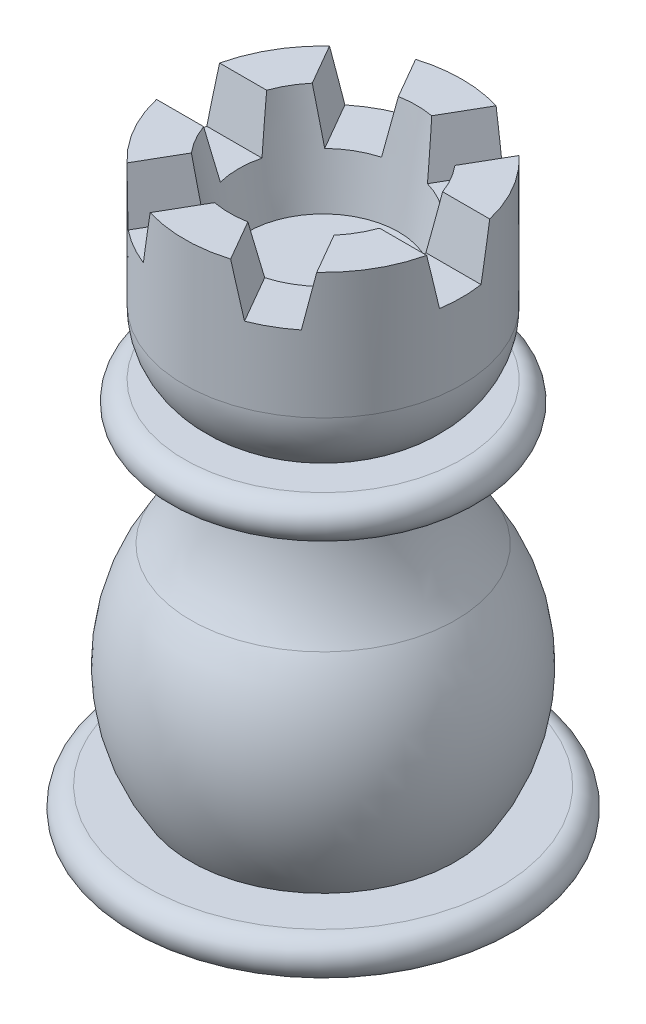
ISO-10303-21;
HEADER;
FILE_DESCRIPTION(('STEP AP214'),'2;1');
FILE_NAME('part.step','',(''),(''),'','','');
FILE_SCHEMA(('AUTOMOTIVE_DESIGN { 1 0 10303 214 1 1 1 1 }'));
ENDSEC;
DATA;
#1=APPLICATION_CONTEXT('core data for automotive mechanical design processes');
#2=APPLICATION_PROTOCOL_DEFINITION('international standard','automotive_design',2000,#1);
#3=PRODUCT_CONTEXT('',#1,'mechanical');
#4=PRODUCT('Part','Part','',(#3));
#5=PRODUCT_RELATED_PRODUCT_CATEGORY('part','',(#4));
#6=PRODUCT_DEFINITION_FORMATION('','',#4);
#7=PRODUCT_DEFINITION_CONTEXT('part definition',#1,'design');
#8=PRODUCT_DEFINITION('design','',#6,#7);
#9=PRODUCT_DEFINITION_SHAPE('','',#8);
#10=(LENGTH_UNIT() NAMED_UNIT(*) SI_UNIT(.MILLI.,.METRE.));
#11=(NAMED_UNIT(*) PLANE_ANGLE_UNIT() SI_UNIT($,.RADIAN.));
#12=(NAMED_UNIT(*) SI_UNIT($,.STERADIAN.) SOLID_ANGLE_UNIT());
#13=UNCERTAINTY_MEASURE_WITH_UNIT(LENGTH_MEASURE(1.E-05),#10,'distance_accuracy_value','');
#14=(GEOMETRIC_REPRESENTATION_CONTEXT(3) GLOBAL_UNCERTAINTY_ASSIGNED_CONTEXT((#13)) GLOBAL_UNIT_ASSIGNED_CONTEXT((#10,
#11,#12)) REPRESENTATION_CONTEXT('',''));
#15=CARTESIAN_POINT('',(0.,0.,0.));
#16=DIRECTION('',(0.,0.,1.));
#17=DIRECTION('',(1.,0.,0.));
#18=AXIS2_PLACEMENT_3D('',#15,#16,#17);
#19=CARTESIAN_POINT('',(0.,46.,0.));
#20=DIRECTION('',(0.,-1.,0.));
#21=DIRECTION('',(0.,0.,-1.));
#22=AXIS2_PLACEMENT_3D('',#19,#20,#21);
#23=PLANE('',#22);
#24=CARTESIAN_POINT('',(0.,46.,0.));
#25=DIRECTION('',(0.,-1.,0.));
#26=DIRECTION('',(0.,0.,-1.));
#27=AXIS2_PLACEMENT_3D('',#24,#25,#26);
#28=CIRCLE('',#27,11.);
#29=CARTESIAN_POINT('',(7.52113483086827,46.,-8.0269876576397));
#30=VERTEX_POINT('',#29);
#31=CARTESIAN_POINT('',(10.7121426428143,46.,-2.5));
#32=VERTEX_POINT('',#31);
#33=EDGE_CURVE('E287',#30,#32,#28,.T.);
#34=ORIENTED_EDGE('',*,*,#33,.F.);
#35=DIRECTION('',(-0.500000000000004,0.,0.866025403784436));
#36=VECTOR('',#35,1.);
#37=CARTESIAN_POINT('',(12.7517603887906,46.,-17.0866968793294));
#38=LINE('',#37,#36);
#39=CARTESIAN_POINT('',(5.65315852006724,46.,-4.79155777999727));
#40=VERTEX_POINT('',#39);
#41=EDGE_CURVE('E382',#30,#40,#38,.T.);
#42=ORIENTED_EDGE('',*,*,#41,.T.);
#43=CARTESIAN_POINT('',(0.,46.,0.));
#44=DIRECTION('',(0.,-1.,0.));
#45=DIRECTION('',(0.,0.,-1.));
#46=AXIS2_PLACEMENT_3D('',#43,#44,#45);
#47=CIRCLE('',#46,7.4106158456677);
#48=CARTESIAN_POINT('',(6.97619002121224,46.,-2.5));
#49=VERTEX_POINT('',#48);
#50=EDGE_CURVE('E299',#40,#49,#47,.T.);
#51=ORIENTED_EDGE('',*,*,#50,.T.);
#52=DIRECTION('',(1.,0.,0.));
#53=VECTOR('',#52,1.);
#54=CARTESIAN_POINT('',(-15.5,46.,-2.5));
#55=LINE('',#54,#53);
#56=EDGE_CURVE('E245',#49,#32,#55,.T.);
#57=ORIENTED_EDGE('',*,*,#56,.T.);
#58=EDGE_LOOP('',(#34,#42,#51,#57));
#59=FACE_BOUND('',#58,.T.);
#60=ADVANCED_FACE('F36',(#59),#23,.F.);
#61=CARTESIAN_POINT('',(-1.32303150114492,46.,-7.29155777999725));
#62=VERTEX_POINT('',#61);
#63=CARTESIAN_POINT('',(1.32303150114505,46.,-7.29155777999729));
#64=VERTEX_POINT('',#63);
#65=EDGE_CURVE('E298',#62,#64,#47,.T.);
#66=ORIENTED_EDGE('',*,*,#65,.T.);
#67=DIRECTION('',(-0.500000000000004,0.,0.866025403784436));
#68=VECTOR('',#67,1.);
#69=CARTESIAN_POINT('',(8.4216333698684,46.,-19.5866968793294));
#70=LINE('',#69,#68);
#71=CARTESIAN_POINT('',(3.19100781194609,46.,-10.5269876576397));
#72=VERTEX_POINT('',#71);
#73=EDGE_CURVE('E379',#72,#64,#70,.T.);
#74=ORIENTED_EDGE('',*,*,#73,.F.);
#75=CARTESIAN_POINT('',(-3.19100781194594,46.,-10.5269876576398));
#76=VERTEX_POINT('',#75);
#77=EDGE_CURVE('E292',#76,#72,#28,.T.);
#78=ORIENTED_EDGE('',*,*,#77,.F.);
#79=DIRECTION('',(-0.499999999999992,0.,-0.866025403784443));
#80=VECTOR('',#79,1.);
#81=CARTESIAN_POINT('',(12.7517603887903,46.,17.0866968793295));
#82=LINE('',#81,#80);
#83=EDGE_CURVE('E367',#62,#76,#82,.T.);
#84=ORIENTED_EDGE('',*,*,#83,.F.);
#85=EDGE_LOOP('',(#66,#74,#78,#84));
#86=FACE_BOUND('',#85,.T.);
#87=ADVANCED_FACE('F396',(#86),#23,.F.);
#88=CARTESIAN_POINT('',(1.32303150114495,46.,7.29155777999731));
#89=VERTEX_POINT('',#88);
#90=CARTESIAN_POINT('',(-1.32303150114505,46.,7.29155777999729));
#91=VERTEX_POINT('',#90);
#92=EDGE_CURVE('E397',#89,#91,#47,.T.);
#93=ORIENTED_EDGE('',*,*,#92,.T.);
#94=CARTESIAN_POINT('',(-3.19100781194609,46.,10.5269876576397));
#95=VERTEX_POINT('',#94);
#96=EDGE_CURVE('E384',#91,#95,#38,.T.);
#97=ORIENTED_EDGE('',*,*,#96,.T.);
#98=CARTESIAN_POINT('',(3.19100781194594,46.,10.5269876576398));
#99=VERTEX_POINT('',#98);
#100=EDGE_CURVE('E485',#99,#95,#28,.T.);
#101=ORIENTED_EDGE('',*,*,#100,.F.);
#102=DIRECTION('',(-0.499999999999992,0.,-0.866025403784443));
#103=VECTOR('',#102,1.);
#104=CARTESIAN_POINT('',(8.42163336986809,46.,19.5866968793294));
#105=LINE('',#104,#103);
#106=EDGE_CURVE('E371',#99,#89,#105,.T.);
#107=ORIENTED_EDGE('',*,*,#106,.T.);
#108=EDGE_LOOP('',(#93,#97,#101,#107));
#109=FACE_BOUND('',#108,.T.);
#110=ADVANCED_FACE('F455',(#109),#23,.F.);
#111=CARTESIAN_POINT('',(-7.52113483086827,46.,8.0269876576397));
#112=VERTEX_POINT('',#111);
#113=CARTESIAN_POINT('',(-10.7121426428143,46.,2.5));
#114=VERTEX_POINT('',#113);
#115=EDGE_CURVE('E291',#112,#114,#28,.T.);
#116=ORIENTED_EDGE('',*,*,#115,.F.);
#117=CARTESIAN_POINT('',(-5.65315852006724,46.,4.79155777999727));
#118=VERTEX_POINT('',#117);
#119=EDGE_CURVE('E380',#118,#112,#70,.T.);
#120=ORIENTED_EDGE('',*,*,#119,.F.);
#121=CARTESIAN_POINT('',(-6.97619002121224,46.,2.5));
#122=VERTEX_POINT('',#121);
#123=EDGE_CURVE('E297',#118,#122,#47,.T.);
#124=ORIENTED_EDGE('',*,*,#123,.T.);
#125=DIRECTION('',(1.,0.,0.));
#126=VECTOR('',#125,1.);
#127=CARTESIAN_POINT('',(-15.5,46.,2.5));
#128=LINE('',#127,#126);
#129=EDGE_CURVE('E254',#114,#122,#128,.T.);
#130=ORIENTED_EDGE('',*,*,#129,.F.);
#131=EDGE_LOOP('',(#116,#120,#124,#130));
#132=FACE_BOUND('',#131,.T.);
#133=ADVANCED_FACE('F467',(#132),#23,.F.);
#134=CARTESIAN_POINT('',(-6.97619002121224,46.,-2.5));
#135=VERTEX_POINT('',#134);
#136=CARTESIAN_POINT('',(-5.65315852006715,46.,-4.79155777999732));
#137=VERTEX_POINT('',#136);
#138=EDGE_CURVE('E294',#135,#137,#47,.T.);
#139=ORIENTED_EDGE('',*,*,#138,.T.);
#140=CARTESIAN_POINT('',(-7.52113483086816,46.,-8.0269876576398));
#141=VERTEX_POINT('',#140);
#142=EDGE_CURVE('E372',#137,#141,#105,.T.);
#143=ORIENTED_EDGE('',*,*,#142,.T.);
#144=CARTESIAN_POINT('',(-10.7121426428143,46.,-2.5));
#145=VERTEX_POINT('',#144);
#146=EDGE_CURVE('E288',#145,#141,#28,.T.);
#147=ORIENTED_EDGE('',*,*,#146,.F.);
#148=EDGE_CURVE('E257',#145,#135,#55,.T.);
#149=ORIENTED_EDGE('',*,*,#148,.T.);
#150=EDGE_LOOP('',(#139,#143,#147,#149));
#151=FACE_BOUND('',#150,.T.);
#152=ADVANCED_FACE('F459',(#151),#23,.F.);
#153=CARTESIAN_POINT('',(0.,27.8746859276655,0.));
#154=DIRECTION('',(0.,-1.,0.));
#155=DIRECTION('',(0.,0.,-1.));
#156=AXIS2_PLACEMENT_3D('',#153,#154,#155);
#157=TOROIDAL_SURFACE('',#156,23.,15.);
#158=CARTESIAN_POINT('',(0.,19.583123951777,0.));
#159=DIRECTION('',(0.,-1.,0.));
#160=DIRECTION('',(0.,0.,-1.));
#161=AXIS2_PLACEMENT_3D('',#158,#159,#160);
#162=CIRCLE('',#161,10.5);
#163=CARTESIAN_POINT('',(0.,19.583123951777,-10.5));
#164=VERTEX_POINT('',#163);
#165=EDGE_CURVE('E313',#164,#164,#162,.T.);
#166=ORIENTED_EDGE('',*,*,#165,.F.);
#167=EDGE_LOOP('',(#166));
#168=FACE_BOUND('',#167,.T.);
#169=CARTESIAN_POINT('',(0.,27.8746859276655,0.));
#170=DIRECTION('',(0.,-1.,0.));
#171=DIRECTION('',(0.,0.,-1.));
#172=AXIS2_PLACEMENT_3D('',#169,#170,#171);
#173=CIRCLE('',#172,8.);
#174=CARTESIAN_POINT('',(0.,27.8746859276655,-8.));
#175=VERTEX_POINT('',#174);
#176=EDGE_CURVE('E272',#175,#175,#173,.T.);
#177=ORIENTED_EDGE('',*,*,#176,.T.);
#178=EDGE_LOOP('',(#177));
#179=FACE_BOUND('',#178,.T.);
#180=ADVANCED_FACE('F38',(#168,#179),#157,.F.);
#181=CARTESIAN_POINT('',(0.,11.2915619758885,0.));
#182=DIRECTION('',(0.,-1.,0.));
#183=DIRECTION('',(0.,0.,-1.));
#184=AXIS2_PLACEMENT_3D('',#181,#182,#183);
#185=DEGENERATE_TOROIDAL_SURFACE('',#184,2.,15.,.F.);
#186=CARTESIAN_POINT('',(0.,3.,0.));
#187=DIRECTION('',(0.,-1.,0.));
#188=DIRECTION('',(0.,0.,-1.));
#189=AXIS2_PLACEMENT_3D('',#186,#187,#188);
#190=CIRCLE('',#189,10.5);
#191=CARTESIAN_POINT('',(0.,3.,-10.5));
#192=VERTEX_POINT('',#191);
#193=EDGE_CURVE('E310',#192,#192,#190,.T.);
#194=ORIENTED_EDGE('',*,*,#193,.F.);
#195=EDGE_LOOP('',(#194));
#196=FACE_BOUND('',#195,.T.);
#197=ORIENTED_EDGE('',*,*,#165,.T.);
#198=EDGE_LOOP('',(#197));
#199=FACE_BOUND('',#198,.T.);
#200=ADVANCED_FACE('F473',(#196,#199),#185,.F.);
#201=CARTESIAN_POINT('',(0.,3.,0.));
#202=DIRECTION('',(0.,1.,0.));
#203=DIRECTION('',(0.,0.,1.));
#204=AXIS2_PLACEMENT_3D('',#201,#202,#203);
#205=PLANE('',#204);
#206=ORIENTED_EDGE('',*,*,#193,.T.);
#207=EDGE_LOOP('',(#206));
#208=FACE_BOUND('',#207,.T.);
#209=CARTESIAN_POINT('',(0.,3.,0.));
#210=DIRECTION('',(0.,-1.,0.));
#211=DIRECTION('',(0.,0.,-1.));
#212=AXIS2_PLACEMENT_3D('',#209,#210,#211);
#213=CIRCLE('',#212,14.);
#214=CARTESIAN_POINT('',(0.,3.,-14.));
#215=VERTEX_POINT('',#214);
#216=EDGE_CURVE('E307',#215,#215,#213,.T.);
#217=ORIENTED_EDGE('',*,*,#216,.F.);
#218=EDGE_LOOP('',(#217));
#219=FACE_BOUND('',#218,.T.);
#220=ADVANCED_FACE('F741',(#208,#219),#205,.T.);
#221=CARTESIAN_POINT('',(0.,1.5,0.));
#222=DIRECTION('',(0.,-1.,0.));
#223=DIRECTION('',(0.,0.,-1.));
#224=AXIS2_PLACEMENT_3D('',#221,#222,#223);
#225=TOROIDAL_SURFACE('',#224,14.,1.5);
#226=ORIENTED_EDGE('',*,*,#216,.T.);
#227=EDGE_LOOP('',(#226));
#228=FACE_BOUND('',#227,.T.);
#229=CARTESIAN_POINT('',(0.,0.,0.));
#230=DIRECTION('',(0.,-1.,0.));
#231=DIRECTION('',(0.,0.,-1.));
#232=AXIS2_PLACEMENT_3D('',#229,#230,#231);
#233=CIRCLE('',#232,14.);
#234=CARTESIAN_POINT('',(0.,0.,-14.));
#235=VERTEX_POINT('',#234);
#236=EDGE_CURVE('E304',#235,#235,#233,.T.);
#237=ORIENTED_EDGE('',*,*,#236,.F.);
#238=EDGE_LOOP('',(#237));
#239=FACE_BOUND('',#238,.T.);
#240=ADVANCED_FACE('F733',(#228,#239),#225,.T.);
#241=CARTESIAN_POINT('',(0.,0.,0.));
#242=DIRECTION('',(0.,-1.,0.));
#243=DIRECTION('',(0.,0.,-1.));
#244=AXIS2_PLACEMENT_3D('',#241,#242,#243);
#245=PLANE('',#244);
#246=ORIENTED_EDGE('',*,*,#236,.T.);
#247=EDGE_LOOP('',(#246));
#248=FACE_BOUND('',#247,.T.);
#249=ADVANCED_FACE('F726',(#248),#245,.T.);
#250=CARTESIAN_POINT('',(0.,38.,0.));
#251=DIRECTION('',(0.,-1.,0.));
#252=DIRECTION('',(0.,0.,-1.));
#253=AXIS2_PLACEMENT_3D('',#250,#251,#252);
#254=PLANE('',#253);
#255=CARTESIAN_POINT('',(0.,38.,0.));
#256=DIRECTION('',(0.,-1.,0.));
#257=DIRECTION('',(0.,0.,-1.));
#258=AXIS2_PLACEMENT_3D('',#255,#256,#257);
#259=CIRCLE('',#258,6.);
#260=CARTESIAN_POINT('',(0.,38.,-6.));
#261=VERTEX_POINT('',#260);
#262=EDGE_CURVE('E301',#261,#261,#259,.T.);
#263=ORIENTED_EDGE('',*,*,#262,.F.);
#264=EDGE_LOOP('',(#263));
#265=FACE_BOUND('',#264,.T.);
#266=ADVANCED_FACE('F465',(#265),#254,.F.);
#267=CARTESIAN_POINT('',(0.,38.,0.));
#268=DIRECTION('',(0.,1.,0.));
#269=DIRECTION('',(0.,0.,1.));
#270=AXIS2_PLACEMENT_3D('',#267,#268,#269);
#271=CONICAL_SURFACE('',#270,6.,0.17453292519943);
#272=CARTESIAN_POINT('',(0.,42.,0.));
#273=DIRECTION('',(0.,-1.,0.));
#274=DIRECTION('',(0.,0.,-1.));
#275=AXIS2_PLACEMENT_3D('',#272,#273,#274);
#276=CIRCLE('',#275,6.70530792283385);
#277=CARTESIAN_POINT('',(-4.67833829772007,42.,4.80357212000653));
#278=VERTEX_POINT('',#277);
#279=CARTESIAN_POINT('',(-1.82084633597635,42.,6.45334587332648));
#280=VERTEX_POINT('',#279);
#281=EDGE_CURVE('E226',#278,#280,#276,.F.);
#282=ORIENTED_EDGE('',*,*,#281,.T.);
#283=CARTESIAN_POINT('',(12.2946594059996,101.028410995168,7.09832491764869));
#284=DIRECTION('',(0.847100670886273,-0.207911690817753,0.489073800366907));
#285=DIRECTION('',(0.180056805991949,0.978147600733807,0.103955845408877));
#286=AXIS2_PLACEMENT_3D('',#283,#284,#285);
#287=ELLIPSE('',#286,82.311914940036,9.55671284905684);
#288=EDGE_CURVE('E242',#280,#91,#287,.F.);
#289=ORIENTED_EDGE('',*,*,#288,.T.);
#290=ORIENTED_EDGE('',*,*,#92,.F.);
#291=CARTESIAN_POINT('',(-12.2946594059996,101.028410995167,7.09832491764846));
#292=DIRECTION('',(-0.84710067088628,-0.207911690817753,0.489073800366896));
#293=DIRECTION('',(-0.180056805991951,0.978147600733807,0.103955845408875));
#294=AXIS2_PLACEMENT_3D('',#291,#292,#293);
#295=ELLIPSE('',#294,82.3119149400353,9.5567128490568);
#296=CARTESIAN_POINT('',(1.82084633597624,42.,6.45334587332648));
#297=VERTEX_POINT('',#296);
#298=EDGE_CURVE('E207',#89,#297,#295,.F.);
#299=ORIENTED_EDGE('',*,*,#298,.T.);
#300=CARTESIAN_POINT('',(4.67833829771997,42.,4.80357212000652));
#301=VERTEX_POINT('',#300);
#302=EDGE_CURVE('E213',#297,#301,#276,.F.);
#303=ORIENTED_EDGE('',*,*,#302,.T.);
#304=CARTESIAN_POINT('',(12.2946594059993,101.028410995165,-7.0983249176483));
#305=DIRECTION('',(0.847100670886279,-0.207911690817753,-0.489073800366896));
#306=DIRECTION('',(0.180056805991951,0.978147600733807,-0.103955845408875));
#307=AXIS2_PLACEMENT_3D('',#304,#305,#306);
#308=ELLIPSE('',#307,82.3119149400333,9.55671284905669);
#309=CARTESIAN_POINT('',(5.65315852006717,46.,4.79155777999735));
#310=VERTEX_POINT('',#309);
#311=EDGE_CURVE('E196',#301,#310,#308,.F.);
#312=ORIENTED_EDGE('',*,*,#311,.T.);
#313=CARTESIAN_POINT('',(6.97619002121224,46.,2.5));
#314=VERTEX_POINT('',#313);
#315=EDGE_CURVE('E300',#314,#310,#47,.T.);
#316=ORIENTED_EDGE('',*,*,#315,.F.);
#317=CARTESIAN_POINT('',(0.,101.028410995167,14.1966498352972));
#318=DIRECTION('',(0.,-0.207911690817753,0.978147600733807));
#319=DIRECTION('',(0.,0.978147600733807,0.207911690817753));
#320=AXIS2_PLACEMENT_3D('',#317,#318,#319);
#321=ELLIPSE('',#320,82.3119149400354,9.55671284905682);
#322=CARTESIAN_POINT('',(6.49918463369636,42.,1.64977375331994));
#323=VERTEX_POINT('',#322);
#324=EDGE_CURVE('E263',#314,#323,#321,.F.);
#325=ORIENTED_EDGE('',*,*,#324,.T.);
#326=CARTESIAN_POINT('',(0.,42.,0.));
#327=DIRECTION('',(0.,-1.,0.));
#328=DIRECTION('',(0.,0.,-1.));
#329=AXIS2_PLACEMENT_3D('',#326,#327,#328);
#330=CIRCLE('',#329,6.70530792283385);
#331=CARTESIAN_POINT('',(6.49918463369637,42.,-1.64977375331994));
#332=VERTEX_POINT('',#331);
#333=EDGE_CURVE('E264',#323,#332,#330,.F.);
#334=ORIENTED_EDGE('',*,*,#333,.T.);
#335=CARTESIAN_POINT('',(0.,101.028410995167,-14.1966498352972));
#336=DIRECTION('',(0.,-0.207911690817753,-0.978147600733807));
#337=DIRECTION('',(0.,0.978147600733807,-0.207911690817753));
#338=AXIS2_PLACEMENT_3D('',#335,#336,#337);
#339=ELLIPSE('',#338,82.3119149400353,9.5567128490568);
#340=EDGE_CURVE('E268',#332,#49,#339,.F.);
#341=ORIENTED_EDGE('',*,*,#340,.T.);
#342=ORIENTED_EDGE('',*,*,#50,.F.);
#343=CARTESIAN_POINT('',(12.2946594059996,101.028410995168,7.09832491764869));
#344=DIRECTION('',(0.847100670886273,-0.207911690817753,0.489073800366907));
#345=DIRECTION('',(0.180056805991949,0.978147600733807,0.103955845408877));
#346=AXIS2_PLACEMENT_3D('',#343,#344,#345);
#347=ELLIPSE('',#346,82.311914940036,9.55671284905684);
#348=CARTESIAN_POINT('',(4.67833829772008,42.,-4.80357212000653));
#349=VERTEX_POINT('',#348);
#350=EDGE_CURVE('E229',#40,#349,#347,.F.);
#351=ORIENTED_EDGE('',*,*,#350,.T.);
#352=CARTESIAN_POINT('',(1.82084633597631,42.,-6.45334587332642));
#353=VERTEX_POINT('',#352);
#354=EDGE_CURVE('E230',#349,#353,#276,.F.);
#355=ORIENTED_EDGE('',*,*,#354,.T.);
#356=CARTESIAN_POINT('',(-12.2946594059992,101.028410995165,-7.09832491764847));
#357=DIRECTION('',(-0.847100670886273,-0.207911690817753,-0.489073800366907));
#358=DIRECTION('',(-0.180056805991949,0.978147600733807,-0.103955845408877));
#359=AXIS2_PLACEMENT_3D('',#356,#357,#358);
#360=ELLIPSE('',#359,82.3119149400333,9.5567128490567);
#361=EDGE_CURVE('E235',#353,#64,#360,.F.);
#362=ORIENTED_EDGE('',*,*,#361,.T.);
#363=ORIENTED_EDGE('',*,*,#65,.F.);
#364=CARTESIAN_POINT('',(12.2946594059993,101.028410995165,-7.0983249176483));
#365=DIRECTION('',(0.847100670886279,-0.207911690817753,-0.489073800366896));
#366=DIRECTION('',(0.180056805991951,0.978147600733807,-0.103955845408875));
#367=AXIS2_PLACEMENT_3D('',#364,#365,#366);
#368=ELLIPSE('',#367,82.3119149400333,9.55671284905669);
#369=CARTESIAN_POINT('',(-1.82084633597622,42.,-6.45334587332644));
#370=VERTEX_POINT('',#369);
#371=EDGE_CURVE('E389',#62,#370,#368,.F.);
#372=ORIENTED_EDGE('',*,*,#371,.T.);
#373=CARTESIAN_POINT('',(-4.67833829772,42.,-4.80357212000656));
#374=VERTEX_POINT('',#373);
#375=EDGE_CURVE('E227',#370,#374,#276,.F.);
#376=ORIENTED_EDGE('',*,*,#375,.T.);
#377=CARTESIAN_POINT('',(-12.2946594059996,101.028410995167,7.09832491764846));
#378=DIRECTION('',(-0.84710067088628,-0.207911690817753,0.489073800366896));
#379=DIRECTION('',(-0.180056805991951,0.978147600733807,0.103955845408875));
#380=AXIS2_PLACEMENT_3D('',#377,#378,#379);
#381=ELLIPSE('',#380,82.3119149400353,9.5567128490568);
#382=EDGE_CURVE('E387',#374,#137,#381,.F.);
#383=ORIENTED_EDGE('',*,*,#382,.T.);
#384=ORIENTED_EDGE('',*,*,#138,.F.);
#385=CARTESIAN_POINT('',(-6.49918463369637,42.,-1.64977375331994));
#386=VERTEX_POINT('',#385);
#387=EDGE_CURVE('E271',#135,#386,#339,.F.);
#388=ORIENTED_EDGE('',*,*,#387,.T.);
#389=CARTESIAN_POINT('',(-6.49918463369636,42.,1.64977375331994));
#390=VERTEX_POINT('',#389);
#391=EDGE_CURVE('E267',#386,#390,#330,.F.);
#392=ORIENTED_EDGE('',*,*,#391,.T.);
#393=EDGE_CURVE('E260',#390,#122,#321,.F.);
#394=ORIENTED_EDGE('',*,*,#393,.T.);
#395=ORIENTED_EDGE('',*,*,#123,.F.);
#396=CARTESIAN_POINT('',(-12.2946594059992,101.028410995165,-7.09832491764847));
#397=DIRECTION('',(-0.847100670886273,-0.207911690817753,-0.489073800366907));
#398=DIRECTION('',(-0.180056805991949,0.978147600733807,-0.103955845408877));
#399=AXIS2_PLACEMENT_3D('',#396,#397,#398);
#400=ELLIPSE('',#399,82.3119149400333,9.5567128490567);
#401=EDGE_CURVE('E239',#118,#278,#400,.F.);
#402=ORIENTED_EDGE('',*,*,#401,.T.);
#403=EDGE_LOOP('',(#282,#289,#290,#299,#303,#312,#316,#325,#334,#341,#342,#351,#355,#362,#363,
#372,#376,#383,#384,#388,#392,#394,#395,#402));
#404=FACE_BOUND('',#403,.T.);
#405=ORIENTED_EDGE('',*,*,#262,.T.);
#406=EDGE_LOOP('',(#405));
#407=FACE_BOUND('',#406,.T.);
#408=ADVANCED_FACE('F223',(#404,#407),#271,.F.);
#409=ORIENTED_EDGE('',*,*,#315,.T.);
#410=CARTESIAN_POINT('',(7.52113483086816,46.,8.02698765763981));
#411=VERTEX_POINT('',#410);
#412=EDGE_CURVE('E202',#411,#310,#82,.T.);
#413=ORIENTED_EDGE('',*,*,#412,.F.);
#414=CARTESIAN_POINT('',(10.7121426428143,46.,2.5));
#415=VERTEX_POINT('',#414);
#416=EDGE_CURVE('E293',#415,#411,#28,.T.);
#417=ORIENTED_EDGE('',*,*,#416,.F.);
#418=EDGE_CURVE('E255',#314,#415,#128,.T.);
#419=ORIENTED_EDGE('',*,*,#418,.F.);
#420=EDGE_LOOP('',(#409,#413,#417,#419));
#421=FACE_BOUND('',#420,.T.);
#422=ADVANCED_FACE('F409',(#421),#23,.F.);
#423=CARTESIAN_POINT('',(0.,0.,0.));
#424=DIRECTION('',(0.,-1.,0.));
#425=DIRECTION('',(0.,0.,-1.));
#426=AXIS2_PLACEMENT_3D('',#423,#424,#425);
#427=CYLINDRICAL_SURFACE('',#426,11.);
#428=ORIENTED_EDGE('',*,*,#100,.T.);
#429=CARTESIAN_POINT('',(0.,34.2384247263035,0.));
#430=DIRECTION('',(0.847100670886273,-0.207911690817753,0.489073800366907));
#431=DIRECTION('',(-0.180056805991949,-0.978147600733807,-0.103955845408877));
#432=AXIS2_PLACEMENT_3D('',#429,#430,#431);
#433=ELLIPSE('',#432,52.9070777921871,11.);
#434=CARTESIAN_POINT('',(-4.00904416225748,42.,10.2434156854571));
#435=VERTEX_POINT('',#434);
#436=EDGE_CURVE('E11',#95,#435,#433,.T.);
#437=ORIENTED_EDGE('',*,*,#436,.T.);
#438=CARTESIAN_POINT('',(0.,42.,0.));
#439=DIRECTION('',(0.,-1.,0.));
#440=DIRECTION('',(0.,0.,-1.));
#441=AXIS2_PLACEMENT_3D('',#438,#439,#440);
#442=CIRCLE('',#441,11.);
#443=CARTESIAN_POINT('',(-6.86653612400121,42.,8.59364193213718));
#444=VERTEX_POINT('',#443);
#445=EDGE_CURVE('E332',#435,#444,#442,.T.);
#446=ORIENTED_EDGE('',*,*,#445,.T.);
#447=CARTESIAN_POINT('',(0.,34.2384247263035,0.));
#448=DIRECTION('',(-0.847100670886273,-0.207911690817753,-0.489073800366907));
#449=DIRECTION('',(0.180056805991949,-0.978147600733807,0.103955845408877));
#450=AXIS2_PLACEMENT_3D('',#447,#448,#449);
#451=ELLIPSE('',#450,52.907077792187,11.);
#452=EDGE_CURVE('E44',#444,#112,#451,.T.);
#453=ORIENTED_EDGE('',*,*,#452,.T.);
#454=ORIENTED_EDGE('',*,*,#115,.T.);
#455=CARTESIAN_POINT('',(0.,34.2384247263035,0.));
#456=DIRECTION('',(0.,-0.207911690817753,0.978147600733807));
#457=DIRECTION('',(0.,-0.978147600733807,-0.207911690817753));
#458=AXIS2_PLACEMENT_3D('',#455,#456,#457);
#459=ELLIPSE('',#458,52.9070777921871,11.);
#460=CARTESIAN_POINT('',(-10.8755802862586,42.,1.64977375331994));
#461=VERTEX_POINT('',#460);
#462=EDGE_CURVE('E316',#114,#461,#459,.T.);
#463=ORIENTED_EDGE('',*,*,#462,.T.);
#464=CARTESIAN_POINT('',(0.,42.,0.));
#465=DIRECTION('',(0.,-1.,0.));
#466=DIRECTION('',(0.,0.,-1.));
#467=AXIS2_PLACEMENT_3D('',#464,#465,#466);
#468=CIRCLE('',#467,11.);
#469=CARTESIAN_POINT('',(-10.8755802862586,42.,-1.64977375331994));
#470=VERTEX_POINT('',#469);
#471=EDGE_CURVE('E319',#461,#470,#468,.T.);
#472=ORIENTED_EDGE('',*,*,#471,.T.);
#473=CARTESIAN_POINT('',(0.,34.2384247263035,0.));
#474=DIRECTION('',(0.,-0.207911690817753,-0.978147600733807));
#475=DIRECTION('',(0.,-0.978147600733807,0.207911690817753));
#476=AXIS2_PLACEMENT_3D('',#473,#474,#475);
#477=ELLIPSE('',#476,52.9070777921871,11.);
#478=EDGE_CURVE('E323',#470,#145,#477,.T.);
#479=ORIENTED_EDGE('',*,*,#478,.T.);
#480=ORIENTED_EDGE('',*,*,#146,.T.);
#481=CARTESIAN_POINT('',(0.,34.2384247263035,0.));
#482=DIRECTION('',(-0.84710067088628,-0.207911690817753,0.489073800366896));
#483=DIRECTION('',(0.180056805991951,-0.978147600733807,-0.103955845408875));
#484=AXIS2_PLACEMENT_3D('',#481,#482,#483);
#485=ELLIPSE('',#484,52.9070777921871,11.);
#486=CARTESIAN_POINT('',(-6.86653612400109,42.,-8.59364193213727));
#487=VERTEX_POINT('',#486);
#488=EDGE_CURVE('E336',#141,#487,#485,.T.);
#489=ORIENTED_EDGE('',*,*,#488,.T.);
#490=CARTESIAN_POINT('',(-4.00904416225733,42.,-10.2434156854572));
#491=VERTEX_POINT('',#490);
#492=EDGE_CURVE('E333',#487,#491,#442,.T.);
#493=ORIENTED_EDGE('',*,*,#492,.T.);
#494=CARTESIAN_POINT('',(0.,34.2384247263035,0.));
#495=DIRECTION('',(0.847100670886279,-0.207911690817753,-0.489073800366896));
#496=DIRECTION('',(-0.180056805991951,-0.978147600733807,0.103955845408875));
#497=AXIS2_PLACEMENT_3D('',#494,#495,#496);
#498=ELLIPSE('',#497,52.9070777921871,11.);
#499=EDGE_CURVE('E339',#491,#76,#498,.T.);
#500=ORIENTED_EDGE('',*,*,#499,.T.);
#501=ORIENTED_EDGE('',*,*,#77,.T.);
#502=CARTESIAN_POINT('',(0.,34.2384247263035,0.));
#503=DIRECTION('',(-0.847100670886273,-0.207911690817753,-0.489073800366907));
#504=DIRECTION('',(0.180056805991949,-0.978147600733807,0.103955845408877));
#505=AXIS2_PLACEMENT_3D('',#502,#503,#504);
#506=ELLIPSE('',#505,52.907077792187,11.);
#507=CARTESIAN_POINT('',(4.00904416225748,42.,-10.2434156854571));
#508=VERTEX_POINT('',#507);
#509=EDGE_CURVE('E342',#72,#508,#506,.T.);
#510=ORIENTED_EDGE('',*,*,#509,.T.);
#511=CARTESIAN_POINT('',(6.86653612400121,42.,-8.59364193213718));
#512=VERTEX_POINT('',#511);
#513=EDGE_CURVE('E345',#508,#512,#442,.T.);
#514=ORIENTED_EDGE('',*,*,#513,.T.);
#515=CARTESIAN_POINT('',(0.,34.2384247263035,0.));
#516=DIRECTION('',(0.847100670886273,-0.207911690817753,0.489073800366907));
#517=DIRECTION('',(-0.180056805991949,-0.978147600733807,-0.103955845408877));
#518=AXIS2_PLACEMENT_3D('',#515,#516,#517);
#519=ELLIPSE('',#518,52.9070777921871,11.);
#520=EDGE_CURVE('E346',#512,#30,#519,.T.);
#521=ORIENTED_EDGE('',*,*,#520,.T.);
#522=ORIENTED_EDGE('',*,*,#33,.T.);
#523=CARTESIAN_POINT('',(10.8755802862586,42.,-1.64977375331994));
#524=VERTEX_POINT('',#523);
#525=EDGE_CURVE('E327',#32,#524,#477,.T.);
#526=ORIENTED_EDGE('',*,*,#525,.T.);
#527=CARTESIAN_POINT('',(10.8755802862586,42.,1.64977375331994));
#528=VERTEX_POINT('',#527);
#529=EDGE_CURVE('E324',#524,#528,#468,.T.);
#530=ORIENTED_EDGE('',*,*,#529,.T.);
#531=EDGE_CURVE('E320',#528,#415,#459,.T.);
#532=ORIENTED_EDGE('',*,*,#531,.T.);
#533=ORIENTED_EDGE('',*,*,#416,.T.);
#534=CARTESIAN_POINT('',(0.,34.2384247263035,0.));
#535=DIRECTION('',(0.847100670886279,-0.207911690817753,-0.489073800366896));
#536=DIRECTION('',(-0.180056805991951,-0.978147600733807,0.103955845408875));
#537=AXIS2_PLACEMENT_3D('',#534,#535,#536);
#538=ELLIPSE('',#537,52.9070777921871,11.);
#539=CARTESIAN_POINT('',(6.86653612400109,42.,8.59364193213728));
#540=VERTEX_POINT('',#539);
#541=EDGE_CURVE('E328',#411,#540,#538,.T.);
#542=ORIENTED_EDGE('',*,*,#541,.T.);
#543=CARTESIAN_POINT('',(4.00904416225734,42.,10.2434156854572));
#544=VERTEX_POINT('',#543);
#545=EDGE_CURVE('E216',#540,#544,#442,.T.);
#546=ORIENTED_EDGE('',*,*,#545,.T.);
#547=CARTESIAN_POINT('',(0.,34.2384247263035,0.));
#548=DIRECTION('',(-0.84710067088628,-0.207911690817753,0.489073800366896));
#549=DIRECTION('',(0.180056805991951,-0.978147600733807,-0.103955845408875));
#550=AXIS2_PLACEMENT_3D('',#547,#548,#549);
#551=ELLIPSE('',#550,52.9070777921871,11.);
#552=EDGE_CURVE('E331',#544,#99,#551,.T.);
#553=ORIENTED_EDGE('',*,*,#552,.T.);
#554=EDGE_LOOP('',(#428,#437,#446,#453,#454,#463,#472,#479,#480,#489,#493,#500,#501,#510,#514,
#521,#522,#526,#530,#532,#533,#542,#546,#553));
#555=FACE_BOUND('',#554,.T.);
#556=CARTESIAN_POINT('',(0.,36.,0.));
#557=DIRECTION('',(0.,-1.,0.));
#558=DIRECTION('',(0.,0.,-1.));
#559=AXIS2_PLACEMENT_3D('',#556,#557,#558);
#560=CIRCLE('',#559,11.);
#561=CARTESIAN_POINT('',(0.,36.,-11.));
#562=VERTEX_POINT('',#561);
#563=EDGE_CURVE('E284',#562,#562,#560,.T.);
#564=ORIENTED_EDGE('',*,*,#563,.F.);
#565=EDGE_LOOP('',(#564));
#566=FACE_BOUND('',#565,.T.);
#567=ADVANCED_FACE('F356',(#555,#566),#427,.T.);
#568=CARTESIAN_POINT('',(0.,36.,0.));
#569=DIRECTION('',(0.,-1.,0.));
#570=DIRECTION('',(0.,0.,-1.));
#571=AXIS2_PLACEMENT_3D('',#568,#569,#570);
#572=DEGENERATE_TOROIDAL_SURFACE('',#571,5.,6.,.T.);
#573=CARTESIAN_POINT('',(0.,30.8746859276655,0.));
#574=DIRECTION('',(0.,-1.,0.));
#575=DIRECTION('',(0.,0.,-1.));
#576=AXIS2_PLACEMENT_3D('',#573,#574,#575);
#577=CIRCLE('',#576,8.11948003037845);
#578=CARTESIAN_POINT('',(0.,30.8746859276655,-8.11948003037845));
#579=VERTEX_POINT('',#578);
#580=EDGE_CURVE('E281',#579,#579,#577,.T.);
#581=ORIENTED_EDGE('',*,*,#580,.F.);
#582=EDGE_LOOP('',(#581));
#583=FACE_BOUND('',#582,.T.);
#584=ORIENTED_EDGE('',*,*,#563,.T.);
#585=EDGE_LOOP('',(#584));
#586=FACE_BOUND('',#585,.T.);
#587=ADVANCED_FACE('F464',(#583,#586),#572,.T.);
#588=CARTESIAN_POINT('',(0.,30.8746859276655,-1.11561196708181E-13));
#589=DIRECTION('',(0.,-1.,0.));
#590=DIRECTION('',(0.,0.,-1.));
#591=AXIS2_PLACEMENT_3D('',#588,#589,#590);
#592=PLANE('',#591);
#593=CARTESIAN_POINT('',(0.,30.8746859276655,0.));
#594=DIRECTION('',(0.,-1.,0.));
#595=DIRECTION('',(0.,0.,-1.));
#596=AXIS2_PLACEMENT_3D('',#593,#594,#595);
#597=CIRCLE('',#596,11.);
#598=CARTESIAN_POINT('',(0.,30.8746859276655,-11.));
#599=VERTEX_POINT('',#598);
#600=EDGE_CURVE('E278',#599,#599,#597,.T.);
#601=ORIENTED_EDGE('',*,*,#600,.F.);
#602=EDGE_LOOP('',(#601));
#603=FACE_BOUND('',#602,.T.);
#604=ORIENTED_EDGE('',*,*,#580,.T.);
#605=EDGE_LOOP('',(#604));
#606=FACE_BOUND('',#605,.T.);
#607=ADVANCED_FACE('F514',(#603,#606),#592,.F.);
#608=CARTESIAN_POINT('',(0.,29.3746859276655,0.));
#609=DIRECTION('',(0.,-1.,0.));
#610=DIRECTION('',(0.,0.,-1.));
#611=AXIS2_PLACEMENT_3D('',#608,#609,#610);
#612=TOROIDAL_SURFACE('',#611,11.,1.5);
#613=CARTESIAN_POINT('',(0.,27.8746859276655,0.));
#614=DIRECTION('',(0.,-1.,0.));
#615=DIRECTION('',(0.,0.,-1.));
#616=AXIS2_PLACEMENT_3D('',#613,#614,#615);
#617=CIRCLE('',#616,11.);
#618=CARTESIAN_POINT('',(0.,27.8746859276655,-11.));
#619=VERTEX_POINT('',#618);
#620=EDGE_CURVE('E275',#619,#619,#617,.T.);
#621=ORIENTED_EDGE('',*,*,#620,.F.);
#622=EDGE_LOOP('',(#621));
#623=FACE_BOUND('',#622,.T.);
#624=ORIENTED_EDGE('',*,*,#600,.T.);
#625=EDGE_LOOP('',(#624));
#626=FACE_BOUND('',#625,.T.);
#627=ADVANCED_FACE('F510',(#623,#626),#612,.T.);
#628=CARTESIAN_POINT('',(0.,27.8746859276655,0.));
#629=DIRECTION('',(0.,1.,0.));
#630=DIRECTION('',(0.,0.,1.));
#631=AXIS2_PLACEMENT_3D('',#628,#629,#630);
#632=PLANE('',#631);
#633=ORIENTED_EDGE('',*,*,#176,.F.);
#634=EDGE_LOOP('',(#633));
#635=FACE_BOUND('',#634,.T.);
#636=ORIENTED_EDGE('',*,*,#620,.T.);
#637=EDGE_LOOP('',(#636));
#638=FACE_BOUND('',#637,.T.);
#639=ADVANCED_FACE('F507',(#635,#638),#632,.F.);
#640=CARTESIAN_POINT('',(-15.5,42.,1.64977375331994));
#641=DIRECTION('',(0.,-0.207911690817753,0.978147600733807));
#642=DIRECTION('',(0.,-0.978147600733807,-0.207911690817753));
#643=AXIS2_PLACEMENT_3D('',#640,#641,#642);
#644=PLANE('',#643);
#645=DIRECTION('',(1.,0.,0.));
#646=VECTOR('',#645,1.);
#647=CARTESIAN_POINT('',(-15.5,42.,1.64977375331994));
#648=LINE('',#647,#646);
#649=EDGE_CURVE('E250',#461,#390,#648,.T.);
#650=ORIENTED_EDGE('',*,*,#649,.F.);
#651=ORIENTED_EDGE('',*,*,#462,.F.);
#652=ORIENTED_EDGE('',*,*,#129,.T.);
#653=ORIENTED_EDGE('',*,*,#393,.F.);
#654=EDGE_LOOP('',(#650,#651,#652,#653));
#655=FACE_BOUND('',#654,.T.);
#656=ADVANCED_FACE('F489',(#655),#644,.F.);
#657=CARTESIAN_POINT('',(-15.5,42.,-1.64977375331994));
#658=DIRECTION('',(0.,-1.,0.));
#659=DIRECTION('',(0.,0.,-1.));
#660=AXIS2_PLACEMENT_3D('',#657,#658,#659);
#661=PLANE('',#660);
#662=DIRECTION('',(1.,0.,0.));
#663=VECTOR('',#662,1.);
#664=CARTESIAN_POINT('',(-15.5,42.,-1.64977375331994));
#665=LINE('',#664,#663);
#666=EDGE_CURVE('E249',#470,#386,#665,.T.);
#667=ORIENTED_EDGE('',*,*,#666,.F.);
#668=ORIENTED_EDGE('',*,*,#471,.F.);
#669=ORIENTED_EDGE('',*,*,#649,.T.);
#670=ORIENTED_EDGE('',*,*,#391,.F.);
#671=EDGE_LOOP('',(#667,#668,#669,#670));
#672=FACE_BOUND('',#671,.T.);
#673=ADVANCED_FACE('F494',(#672),#661,.F.);
#674=CARTESIAN_POINT('',(-15.5,42.,-1.64977375331994));
#675=DIRECTION('',(0.,-0.207911690817753,-0.978147600733807));
#676=DIRECTION('',(0.,0.978147600733807,-0.207911690817753));
#677=AXIS2_PLACEMENT_3D('',#674,#675,#676);
#678=PLANE('',#677);
#679=ORIENTED_EDGE('',*,*,#148,.F.);
#680=ORIENTED_EDGE('',*,*,#478,.F.);
#681=ORIENTED_EDGE('',*,*,#666,.T.);
#682=ORIENTED_EDGE('',*,*,#387,.F.);
#683=EDGE_LOOP('',(#679,#680,#681,#682));
#684=FACE_BOUND('',#683,.T.);
#685=ADVANCED_FACE('F497',(#684),#678,.F.);
#686=EDGE_CURVE('E246',#332,#524,#665,.T.);
#687=ORIENTED_EDGE('',*,*,#686,.T.);
#688=ORIENTED_EDGE('',*,*,#525,.F.);
#689=ORIENTED_EDGE('',*,*,#56,.F.);
#690=ORIENTED_EDGE('',*,*,#340,.F.);
#691=EDGE_LOOP('',(#687,#688,#689,#690));
#692=FACE_BOUND('',#691,.T.);
#693=ADVANCED_FACE('F426',(#692),#678,.F.);
#694=EDGE_CURVE('E251',#323,#528,#648,.T.);
#695=ORIENTED_EDGE('',*,*,#694,.T.);
#696=ORIENTED_EDGE('',*,*,#529,.F.);
#697=ORIENTED_EDGE('',*,*,#686,.F.);
#698=ORIENTED_EDGE('',*,*,#333,.F.);
#699=EDGE_LOOP('',(#695,#696,#697,#698));
#700=FACE_BOUND('',#699,.T.);
#701=ADVANCED_FACE('F419',(#700),#661,.F.);
#702=ORIENTED_EDGE('',*,*,#418,.T.);
#703=ORIENTED_EDGE('',*,*,#531,.F.);
#704=ORIENTED_EDGE('',*,*,#694,.F.);
#705=ORIENTED_EDGE('',*,*,#324,.F.);
#706=EDGE_LOOP('',(#702,#703,#704,#705));
#707=FACE_BOUND('',#706,.T.);
#708=ADVANCED_FACE('F415',(#707),#644,.F.);
#709=CARTESIAN_POINT('',(12.0154428602011,42.,17.5118100026695));
#710=DIRECTION('',(0.847100670886279,-0.207911690817753,-0.489073800366896));
#711=DIRECTION('',(-0.499999999999992,0.,-0.866025403784443));
#712=AXIS2_PLACEMENT_3D('',#709,#710,#711);
#713=PLANE('',#712);
#714=DIRECTION('',(-0.499999999999992,0.,-0.866025403784443));
#715=VECTOR('',#714,1.);
#716=CARTESIAN_POINT('',(12.0154428602011,42.,17.5118100026695));
#717=LINE('',#716,#715);
#718=EDGE_CURVE('E199',#540,#301,#717,.T.);
#719=ORIENTED_EDGE('',*,*,#718,.F.);
#720=ORIENTED_EDGE('',*,*,#541,.F.);
#721=ORIENTED_EDGE('',*,*,#412,.T.);
#722=ORIENTED_EDGE('',*,*,#311,.F.);
#723=EDGE_LOOP('',(#719,#720,#721,#722));
#724=FACE_BOUND('',#723,.T.);
#725=ADVANCED_FACE('F198',(#724),#713,.F.);
#726=CARTESIAN_POINT('',(9.15795089845732,42.,19.1615837559894));
#727=DIRECTION('',(-0.84710067088628,-0.207911690817753,0.489073800366896));
#728=DIRECTION('',(0.499999999999992,0.,0.866025403784443));
#729=AXIS2_PLACEMENT_3D('',#726,#727,#728);
#730=PLANE('',#729);
#731=ORIENTED_EDGE('',*,*,#106,.F.);
#732=ORIENTED_EDGE('',*,*,#552,.F.);
#733=DIRECTION('',(-0.499999999999992,0.,-0.866025403784443));
#734=VECTOR('',#733,1.);
#735=CARTESIAN_POINT('',(9.15795089845732,42.,19.1615837559894));
#736=LINE('',#735,#734);
#737=EDGE_CURVE('E482',#544,#297,#736,.T.);
#738=ORIENTED_EDGE('',*,*,#737,.T.);
#739=ORIENTED_EDGE('',*,*,#298,.F.);
#740=EDGE_LOOP('',(#731,#732,#738,#739));
#741=FACE_BOUND('',#740,.T.);
#742=ADVANCED_FACE('F627',(#741),#730,.F.);
#743=CARTESIAN_POINT('',(12.0154428602014,42.,-17.5118100026694));
#744=DIRECTION('',(0.,-1.,0.));
#745=DIRECTION('',(0.,0.,-1.));
#746=AXIS2_PLACEMENT_3D('',#743,#744,#745);
#747=PLANE('',#746);
#748=ORIENTED_EDGE('',*,*,#737,.F.);
#749=ORIENTED_EDGE('',*,*,#545,.F.);
#750=ORIENTED_EDGE('',*,*,#718,.T.);
#751=ORIENTED_EDGE('',*,*,#302,.F.);
#752=EDGE_LOOP('',(#748,#749,#750,#751));
#753=FACE_BOUND('',#752,.T.);
#754=ADVANCED_FACE('F212',(#753),#747,.F.);
#755=EDGE_CURVE('E218',#374,#487,#736,.T.);
#756=ORIENTED_EDGE('',*,*,#755,.T.);
#757=ORIENTED_EDGE('',*,*,#488,.F.);
#758=ORIENTED_EDGE('',*,*,#142,.F.);
#759=ORIENTED_EDGE('',*,*,#382,.F.);
#760=EDGE_LOOP('',(#756,#757,#758,#759));
#761=FACE_BOUND('',#760,.T.);
#762=ADVANCED_FACE('F481',(#761),#730,.F.);
#763=ORIENTED_EDGE('',*,*,#83,.T.);
#764=ORIENTED_EDGE('',*,*,#499,.F.);
#765=EDGE_CURVE('E219',#370,#491,#717,.T.);
#766=ORIENTED_EDGE('',*,*,#765,.F.);
#767=ORIENTED_EDGE('',*,*,#371,.F.);
#768=EDGE_LOOP('',(#763,#764,#766,#767));
#769=FACE_BOUND('',#768,.T.);
#770=ADVANCED_FACE('F445',(#769),#713,.F.);
#771=ORIENTED_EDGE('',*,*,#765,.T.);
#772=ORIENTED_EDGE('',*,*,#492,.F.);
#773=ORIENTED_EDGE('',*,*,#755,.F.);
#774=ORIENTED_EDGE('',*,*,#375,.F.);
#775=EDGE_LOOP('',(#771,#772,#773,#774));
#776=FACE_BOUND('',#775,.T.);
#777=ADVANCED_FACE('F363',(#776),#747,.F.);
#778=CARTESIAN_POINT('',(9.15795089845763,42.,-19.1615837559893));
#779=DIRECTION('',(-0.847100670886273,-0.207911690817753,-0.489073800366907));
#780=DIRECTION('',(-0.500000000000004,0.,0.866025403784436));
#781=AXIS2_PLACEMENT_3D('',#778,#779,#780);
#782=PLANE('',#781);
#783=DIRECTION('',(-0.500000000000004,0.,0.866025403784436));
#784=VECTOR('',#783,1.);
#785=CARTESIAN_POINT('',(9.15795089845763,42.,-19.1615837559893));
#786=LINE('',#785,#784);
#787=EDGE_CURVE('E59',#508,#353,#786,.T.);
#788=ORIENTED_EDGE('',*,*,#787,.F.);
#789=ORIENTED_EDGE('',*,*,#509,.F.);
#790=ORIENTED_EDGE('',*,*,#73,.T.);
#791=ORIENTED_EDGE('',*,*,#361,.F.);
#792=EDGE_LOOP('',(#788,#789,#790,#791));
#793=FACE_BOUND('',#792,.T.);
#794=ADVANCED_FACE('F435',(#793),#782,.F.);
#795=DIRECTION('',(-0.500000000000004,0.,0.866025403784436));
#796=VECTOR('',#795,1.);
#797=CARTESIAN_POINT('',(12.0154428602014,42.,-17.5118100026694));
#798=LINE('',#797,#796);
#799=EDGE_CURVE('E208',#512,#349,#798,.T.);
#800=ORIENTED_EDGE('',*,*,#799,.F.);
#801=ORIENTED_EDGE('',*,*,#513,.F.);
#802=ORIENTED_EDGE('',*,*,#787,.T.);
#803=ORIENTED_EDGE('',*,*,#354,.F.);
#804=EDGE_LOOP('',(#800,#801,#802,#803));
#805=FACE_BOUND('',#804,.T.);
#806=ADVANCED_FACE('F434',(#805),#747,.F.);
#807=CARTESIAN_POINT('',(12.0154428602014,42.,-17.5118100026694));
#808=DIRECTION('',(0.847100670886273,-0.207911690817753,0.489073800366907));
#809=DIRECTION('',(0.500000000000004,0.,-0.866025403784436));
#810=AXIS2_PLACEMENT_3D('',#807,#808,#809);
#811=PLANE('',#810);
#812=ORIENTED_EDGE('',*,*,#41,.F.);
#813=ORIENTED_EDGE('',*,*,#520,.F.);
#814=ORIENTED_EDGE('',*,*,#799,.T.);
#815=ORIENTED_EDGE('',*,*,#350,.F.);
#816=EDGE_LOOP('',(#812,#813,#814,#815));
#817=FACE_BOUND('',#816,.T.);
#818=ADVANCED_FACE('F431',(#817),#811,.F.);
#819=EDGE_CURVE('E375',#280,#435,#798,.T.);
#820=ORIENTED_EDGE('',*,*,#819,.T.);
#821=ORIENTED_EDGE('',*,*,#436,.F.);
#822=ORIENTED_EDGE('',*,*,#96,.F.);
#823=ORIENTED_EDGE('',*,*,#288,.F.);
#824=EDGE_LOOP('',(#820,#821,#822,#823));
#825=FACE_BOUND('',#824,.T.);
#826=ADVANCED_FACE('F448',(#825),#811,.F.);
#827=ORIENTED_EDGE('',*,*,#119,.T.);
#828=ORIENTED_EDGE('',*,*,#452,.F.);
#829=EDGE_CURVE('E51',#278,#444,#786,.T.);
#830=ORIENTED_EDGE('',*,*,#829,.F.);
#831=ORIENTED_EDGE('',*,*,#401,.F.);
#832=EDGE_LOOP('',(#827,#828,#830,#831));
#833=FACE_BOUND('',#832,.T.);
#834=ADVANCED_FACE('F438',(#833),#782,.F.);
#835=ORIENTED_EDGE('',*,*,#829,.T.);
#836=ORIENTED_EDGE('',*,*,#445,.F.);
#837=ORIENTED_EDGE('',*,*,#819,.F.);
#838=ORIENTED_EDGE('',*,*,#281,.F.);
#839=EDGE_LOOP('',(#835,#836,#837,#838));
#840=FACE_BOUND('',#839,.T.);
#841=ADVANCED_FACE('F444',(#840),#747,.F.);
#842=CLOSED_SHELL('',(#60,#87,#110,#133,#152,#180,#200,#220,#240,#249,#266,#408,#422,#567,#587,
#607,#627,#639,#656,#673,#685,#693,#701,#708,#725,#742,#754,#762,#770,#777,#794,#806,#818,#826,
#834,#841));
#843=MANIFOLD_SOLID_BREP('B2',#842);
#844=ADVANCED_BREP_SHAPE_REPRESENTATION('',(#18,#843),#14);
#845=SHAPE_DEFINITION_REPRESENTATION(#9,#844);
ENDSEC;
END-ISO-10303-21;
